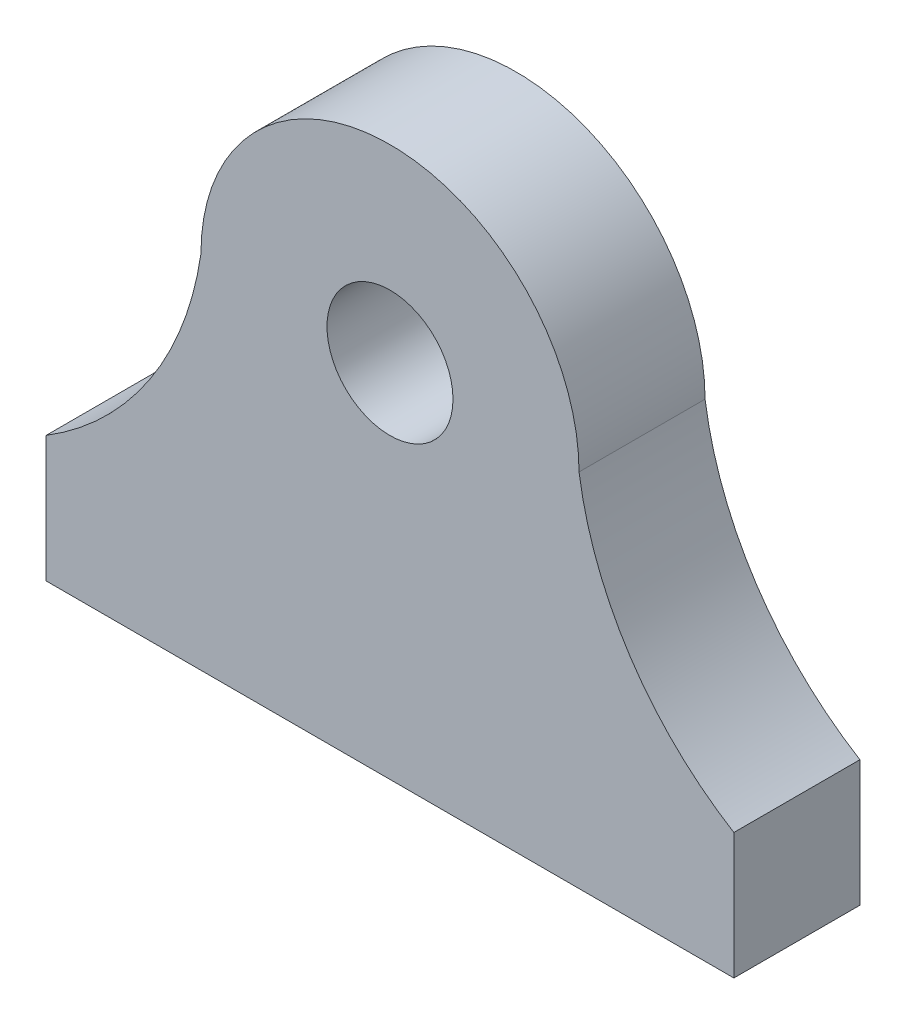
ISO-10303-21;
HEADER;
FILE_DESCRIPTION(('STEP AP214'),'2;1');
FILE_NAME('part.step','',(''),(''),'','','');
FILE_SCHEMA(('AUTOMOTIVE_DESIGN { 1 0 10303 214 1 1 1 1 }'));
ENDSEC;
DATA;
#1=APPLICATION_CONTEXT('core data for automotive mechanical design processes');
#2=APPLICATION_PROTOCOL_DEFINITION('international standard','automotive_design',2000,#1);
#3=PRODUCT_CONTEXT('',#1,'mechanical');
#4=PRODUCT('Part','Part','',(#3));
#5=PRODUCT_RELATED_PRODUCT_CATEGORY('part','',(#4));
#6=PRODUCT_DEFINITION_FORMATION('','',#4);
#7=PRODUCT_DEFINITION_CONTEXT('part definition',#1,'design');
#8=PRODUCT_DEFINITION('design','',#6,#7);
#9=PRODUCT_DEFINITION_SHAPE('','',#8);
#10=(LENGTH_UNIT() NAMED_UNIT(*) SI_UNIT(.MILLI.,.METRE.));
#11=(NAMED_UNIT(*) PLANE_ANGLE_UNIT() SI_UNIT($,.RADIAN.));
#12=(NAMED_UNIT(*) SI_UNIT($,.STERADIAN.) SOLID_ANGLE_UNIT());
#13=UNCERTAINTY_MEASURE_WITH_UNIT(LENGTH_MEASURE(1.E-05),#10,'distance_accuracy_value','');
#14=(GEOMETRIC_REPRESENTATION_CONTEXT(3) GLOBAL_UNCERTAINTY_ASSIGNED_CONTEXT((#13)) GLOBAL_UNIT_ASSIGNED_CONTEXT((#10,
#11,#12)) REPRESENTATION_CONTEXT('',''));
#15=CARTESIAN_POINT('',(0.,0.,0.));
#16=DIRECTION('',(0.,0.,1.));
#17=DIRECTION('',(1.,0.,0.));
#18=AXIS2_PLACEMENT_3D('',#15,#16,#17);
#19=CARTESIAN_POINT('',(-41.0271316824658,3.7982845149857,10.));
#20=DIRECTION('',(0.,0.,-1.));
#21=DIRECTION('',(-1.,0.,0.));
#22=AXIS2_PLACEMENT_3D('',#19,#20,#21);
#23=PLANE('',#22);
#24=DIRECTION('',(0.,1.,0.));
#25=VECTOR('',#24,1.);
#26=CARTESIAN_POINT('',(27.2861445226819,-18.6299080280582,10.));
#27=LINE('',#26,#25);
#28=CARTESIAN_POINT('',(27.2861445226819,-28.6299080280581,10.));
#29=VERTEX_POINT('',#28);
#30=CARTESIAN_POINT('',(27.2861445226819,-18.6299080280582,10.));
#31=VERTEX_POINT('',#30);
#32=EDGE_CURVE('E150',#29,#31,#27,.T.);
#33=ORIENTED_EDGE('',*,*,#32,.T.);
#34=CARTESIAN_POINT('',(41.0271316824658,3.7982845149857,10.));
#35=DIRECTION('',(0.,0.,-1.));
#36=DIRECTION('',(1.,0.,0.));
#37=AXIS2_PLACEMENT_3D('',#34,#35,#36);
#38=CIRCLE('',#37,26.3028239714521);
#39=CARTESIAN_POINT('',(15.,0.,10.));
#40=VERTEX_POINT('',#39);
#41=EDGE_CURVE('E98',#31,#40,#38,.T.);
#42=ORIENTED_EDGE('',*,*,#41,.T.);
#43=CARTESIAN_POINT('',(0.,0.,10.));
#44=DIRECTION('',(0.,0.,1.));
#45=DIRECTION('',(1.,0.,0.));
#46=AXIS2_PLACEMENT_3D('',#43,#44,#45);
#47=CIRCLE('',#46,15.);
#48=CARTESIAN_POINT('',(-15.,0.,10.));
#49=VERTEX_POINT('',#48);
#50=EDGE_CURVE('E111',#40,#49,#47,.T.);
#51=ORIENTED_EDGE('',*,*,#50,.T.);
#52=CARTESIAN_POINT('',(-41.0271316824658,3.7982845149857,10.));
#53=DIRECTION('',(0.,0.,-1.));
#54=DIRECTION('',(-1.,0.,0.));
#55=AXIS2_PLACEMENT_3D('',#52,#53,#54);
#56=CIRCLE('',#55,26.3028239714521);
#57=CARTESIAN_POINT('',(-27.2861445226819,-18.6299080280582,10.));
#58=VERTEX_POINT('',#57);
#59=EDGE_CURVE('E105',#49,#58,#56,.T.);
#60=ORIENTED_EDGE('',*,*,#59,.T.);
#61=DIRECTION('',(0.,-1.,0.));
#62=VECTOR('',#61,1.);
#63=CARTESIAN_POINT('',(-27.2861445226819,-18.6299080280582,10.));
#64=LINE('',#63,#62);
#65=CARTESIAN_POINT('',(-27.2861445226819,-28.6299080280582,10.));
#66=VERTEX_POINT('',#65);
#67=EDGE_CURVE('E109',#58,#66,#64,.T.);
#68=ORIENTED_EDGE('',*,*,#67,.T.);
#69=DIRECTION('',(1.,0.,0.));
#70=VECTOR('',#69,1.);
#71=CARTESIAN_POINT('',(-27.2861445226819,-28.6299080280582,10.));
#72=LINE('',#71,#70);
#73=EDGE_CURVE('E61',#66,#29,#72,.T.);
#74=ORIENTED_EDGE('',*,*,#73,.T.);
#75=EDGE_LOOP('',(#33,#42,#51,#60,#68,#74));
#76=FACE_BOUND('',#75,.T.);
#77=CARTESIAN_POINT('',(0.,0.,10.));
#78=DIRECTION('',(0.,0.,1.));
#79=DIRECTION('',(1.,0.,0.));
#80=AXIS2_PLACEMENT_3D('',#77,#78,#79);
#81=CIRCLE('',#80,5.);
#82=CARTESIAN_POINT('',(5.,0.,10.));
#83=VERTEX_POINT('',#82);
#84=EDGE_CURVE('E138',#83,#83,#81,.T.);
#85=ORIENTED_EDGE('',*,*,#84,.F.);
#86=EDGE_LOOP('',(#85));
#87=FACE_BOUND('',#86,.T.);
#88=ADVANCED_FACE('F43',(#76,#87),#23,.F.);
#89=CARTESIAN_POINT('',(-41.0271316824658,3.7982845149857,0.));
#90=DIRECTION('',(0.,0.,-1.));
#91=DIRECTION('',(-1.,0.,0.));
#92=AXIS2_PLACEMENT_3D('',#89,#90,#91);
#93=PLANE('',#92);
#94=DIRECTION('',(0.,1.,0.));
#95=VECTOR('',#94,1.);
#96=CARTESIAN_POINT('',(27.2861445226819,-18.6299080280582,0.));
#97=LINE('',#96,#95);
#98=CARTESIAN_POINT('',(27.2861445226819,-28.6299080280581,0.));
#99=VERTEX_POINT('',#98);
#100=CARTESIAN_POINT('',(27.2861445226819,-18.6299080280582,0.));
#101=VERTEX_POINT('',#100);
#102=EDGE_CURVE('E133',#99,#101,#97,.T.);
#103=ORIENTED_EDGE('',*,*,#102,.F.);
#104=DIRECTION('',(1.,0.,0.));
#105=VECTOR('',#104,1.);
#106=CARTESIAN_POINT('',(-27.2861445226819,-28.6299080280582,0.));
#107=LINE('',#106,#105);
#108=CARTESIAN_POINT('',(-27.2861445226819,-28.6299080280582,0.));
#109=VERTEX_POINT('',#108);
#110=EDGE_CURVE('E90',#109,#99,#107,.T.);
#111=ORIENTED_EDGE('',*,*,#110,.F.);
#112=DIRECTION('',(0.,-1.,0.));
#113=VECTOR('',#112,1.);
#114=CARTESIAN_POINT('',(-27.2861445226819,-18.6299080280582,0.));
#115=LINE('',#114,#113);
#116=CARTESIAN_POINT('',(-27.2861445226819,-18.6299080280582,0.));
#117=VERTEX_POINT('',#116);
#118=EDGE_CURVE('E84',#117,#109,#115,.T.);
#119=ORIENTED_EDGE('',*,*,#118,.F.);
#120=CARTESIAN_POINT('',(-41.0271316824658,3.7982845149857,0.));
#121=DIRECTION('',(0.,0.,-1.));
#122=DIRECTION('',(-1.,0.,0.));
#123=AXIS2_PLACEMENT_3D('',#120,#121,#122);
#124=CIRCLE('',#123,26.3028239714521);
#125=CARTESIAN_POINT('',(-15.,0.,0.));
#126=VERTEX_POINT('',#125);
#127=EDGE_CURVE('E120',#126,#117,#124,.T.);
#128=ORIENTED_EDGE('',*,*,#127,.F.);
#129=CARTESIAN_POINT('',(0.,0.,0.));
#130=DIRECTION('',(0.,0.,1.));
#131=DIRECTION('',(1.,0.,0.));
#132=AXIS2_PLACEMENT_3D('',#129,#130,#131);
#133=CIRCLE('',#132,15.);
#134=CARTESIAN_POINT('',(15.,0.,0.));
#135=VERTEX_POINT('',#134);
#136=EDGE_CURVE('E141',#135,#126,#133,.T.);
#137=ORIENTED_EDGE('',*,*,#136,.F.);
#138=CARTESIAN_POINT('',(41.0271316824658,3.7982845149857,0.));
#139=DIRECTION('',(0.,0.,-1.));
#140=DIRECTION('',(1.,0.,0.));
#141=AXIS2_PLACEMENT_3D('',#138,#139,#140);
#142=CIRCLE('',#141,26.3028239714521);
#143=EDGE_CURVE('E137',#101,#135,#142,.T.);
#144=ORIENTED_EDGE('',*,*,#143,.F.);
#145=EDGE_LOOP('',(#103,#111,#119,#128,#137,#144));
#146=FACE_BOUND('',#145,.T.);
#147=CARTESIAN_POINT('',(0.,0.,0.));
#148=DIRECTION('',(0.,0.,1.));
#149=DIRECTION('',(1.,0.,0.));
#150=AXIS2_PLACEMENT_3D('',#147,#148,#149);
#151=CIRCLE('',#150,5.);
#152=CARTESIAN_POINT('',(5.,0.,0.));
#153=VERTEX_POINT('',#152);
#154=EDGE_CURVE('E265',#153,#153,#151,.T.);
#155=ORIENTED_EDGE('',*,*,#154,.T.);
#156=EDGE_LOOP('',(#155));
#157=FACE_BOUND('',#156,.T.);
#158=ADVANCED_FACE('F163',(#146,#157),#93,.T.);
#159=CARTESIAN_POINT('',(27.2861445226819,-18.6299080280582,10.));
#160=DIRECTION('',(-1.,0.,0.));
#161=DIRECTION('',(0.,-1.,0.));
#162=AXIS2_PLACEMENT_3D('',#159,#160,#161);
#163=PLANE('',#162);
#164=ORIENTED_EDGE('',*,*,#102,.T.);
#165=DIRECTION('',(0.,0.,-1.));
#166=VECTOR('',#165,1.);
#167=CARTESIAN_POINT('',(27.2861445226819,-18.6299080280582,10.));
#168=LINE('',#167,#166);
#169=EDGE_CURVE('E11',#31,#101,#168,.T.);
#170=ORIENTED_EDGE('',*,*,#169,.F.);
#171=ORIENTED_EDGE('',*,*,#32,.F.);
#172=DIRECTION('',(0.,0.,-1.));
#173=VECTOR('',#172,1.);
#174=CARTESIAN_POINT('',(27.2861445226819,-28.6299080280581,10.));
#175=LINE('',#174,#173);
#176=EDGE_CURVE('E129',#29,#99,#175,.T.);
#177=ORIENTED_EDGE('',*,*,#176,.T.);
#178=EDGE_LOOP('',(#164,#170,#171,#177));
#179=FACE_BOUND('',#178,.T.);
#180=ADVANCED_FACE('F45',(#179),#163,.F.);
#181=CARTESIAN_POINT('',(41.0271316824658,3.7982845149857,10.));
#182=DIRECTION('',(0.,0.,-1.));
#183=DIRECTION('',(-1.,0.,0.));
#184=AXIS2_PLACEMENT_3D('',#181,#182,#183);
#185=CYLINDRICAL_SURFACE('',#184,26.3028239714521);
#186=ORIENTED_EDGE('',*,*,#143,.T.);
#187=DIRECTION('',(0.,0.,-1.));
#188=VECTOR('',#187,1.);
#189=CARTESIAN_POINT('',(15.,0.,10.));
#190=LINE('',#189,#188);
#191=EDGE_CURVE('E53',#40,#135,#190,.T.);
#192=ORIENTED_EDGE('',*,*,#191,.F.);
#193=ORIENTED_EDGE('',*,*,#41,.F.);
#194=ORIENTED_EDGE('',*,*,#169,.T.);
#195=EDGE_LOOP('',(#186,#192,#193,#194));
#196=FACE_BOUND('',#195,.T.);
#197=ADVANCED_FACE('F188',(#196),#185,.F.);
#198=CARTESIAN_POINT('',(0.,0.,10.));
#199=DIRECTION('',(0.,0.,-1.));
#200=DIRECTION('',(-1.,0.,0.));
#201=AXIS2_PLACEMENT_3D('',#198,#199,#200);
#202=CYLINDRICAL_SURFACE('',#201,15.);
#203=ORIENTED_EDGE('',*,*,#136,.T.);
#204=DIRECTION('',(0.,0.,-1.));
#205=VECTOR('',#204,1.);
#206=CARTESIAN_POINT('',(-15.,0.,10.));
#207=LINE('',#206,#205);
#208=EDGE_CURVE('E122',#49,#126,#207,.T.);
#209=ORIENTED_EDGE('',*,*,#208,.F.);
#210=ORIENTED_EDGE('',*,*,#50,.F.);
#211=ORIENTED_EDGE('',*,*,#191,.T.);
#212=EDGE_LOOP('',(#203,#209,#210,#211));
#213=FACE_BOUND('',#212,.T.);
#214=ADVANCED_FACE('F160',(#213),#202,.T.);
#215=CARTESIAN_POINT('',(-41.0271316824658,3.7982845149857,10.));
#216=DIRECTION('',(0.,0.,-1.));
#217=DIRECTION('',(-1.,0.,0.));
#218=AXIS2_PLACEMENT_3D('',#215,#216,#217);
#219=CYLINDRICAL_SURFACE('',#218,26.3028239714521);
#220=ORIENTED_EDGE('',*,*,#127,.T.);
#221=DIRECTION('',(0.,0.,-1.));
#222=VECTOR('',#221,1.);
#223=CARTESIAN_POINT('',(-27.2861445226819,-18.6299080280582,10.));
#224=LINE('',#223,#222);
#225=EDGE_CURVE('E117',#58,#117,#224,.T.);
#226=ORIENTED_EDGE('',*,*,#225,.F.);
#227=ORIENTED_EDGE('',*,*,#59,.F.);
#228=ORIENTED_EDGE('',*,*,#208,.T.);
#229=EDGE_LOOP('',(#220,#226,#227,#228));
#230=FACE_BOUND('',#229,.T.);
#231=ADVANCED_FACE('F118',(#230),#219,.F.);
#232=CARTESIAN_POINT('',(-27.2861445226819,-18.6299080280582,10.));
#233=DIRECTION('',(1.,0.,0.));
#234=DIRECTION('',(0.,0.,-1.));
#235=AXIS2_PLACEMENT_3D('',#232,#233,#234);
#236=PLANE('',#235);
#237=ORIENTED_EDGE('',*,*,#118,.T.);
#238=DIRECTION('',(0.,0.,-1.));
#239=VECTOR('',#238,1.);
#240=CARTESIAN_POINT('',(-27.2861445226819,-28.6299080280582,10.));
#241=LINE('',#240,#239);
#242=EDGE_CURVE('E123',#66,#109,#241,.T.);
#243=ORIENTED_EDGE('',*,*,#242,.F.);
#244=ORIENTED_EDGE('',*,*,#67,.F.);
#245=ORIENTED_EDGE('',*,*,#225,.T.);
#246=EDGE_LOOP('',(#237,#243,#244,#245));
#247=FACE_BOUND('',#246,.T.);
#248=ADVANCED_FACE('F125',(#247),#236,.F.);
#249=CARTESIAN_POINT('',(-27.2861445226819,-28.6299080280582,10.));
#250=DIRECTION('',(0.,1.,0.));
#251=DIRECTION('',(-1.,0.,0.));
#252=AXIS2_PLACEMENT_3D('',#249,#250,#251);
#253=PLANE('',#252);
#254=ORIENTED_EDGE('',*,*,#110,.T.);
#255=ORIENTED_EDGE('',*,*,#176,.F.);
#256=ORIENTED_EDGE('',*,*,#73,.F.);
#257=ORIENTED_EDGE('',*,*,#242,.T.);
#258=EDGE_LOOP('',(#254,#255,#256,#257));
#259=FACE_BOUND('',#258,.T.);
#260=ADVANCED_FACE('F168',(#259),#253,.F.);
#261=CARTESIAN_POINT('',(0.,0.,10.));
#262=DIRECTION('',(0.,0.,-1.));
#263=DIRECTION('',(-1.,0.,0.));
#264=AXIS2_PLACEMENT_3D('',#261,#262,#263);
#265=CYLINDRICAL_SURFACE('',#264,5.);
#266=ORIENTED_EDGE('',*,*,#84,.T.);
#267=EDGE_LOOP('',(#266));
#268=FACE_BOUND('',#267,.T.);
#269=ORIENTED_EDGE('',*,*,#154,.F.);
#270=EDGE_LOOP('',(#269));
#271=FACE_BOUND('',#270,.T.);
#272=ADVANCED_FACE('F170',(#268,#271),#265,.F.);
#273=CLOSED_SHELL('',(#88,#158,#180,#197,#214,#231,#248,#260,#272));
#274=MANIFOLD_SOLID_BREP('B2',#273);
#275=ADVANCED_BREP_SHAPE_REPRESENTATION('',(#18,#274),#14);
#276=SHAPE_DEFINITION_REPRESENTATION(#9,#275);
ENDSEC;
END-ISO-10303-21;
